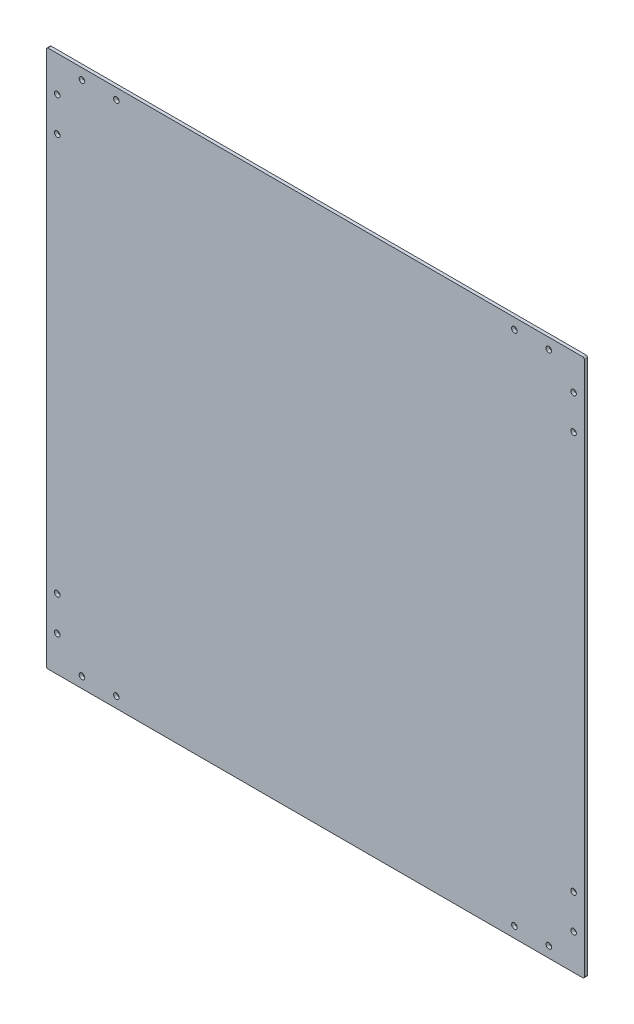
ISO-10303-21;
HEADER;
FILE_DESCRIPTION(('STEP AP214'),'2;1');
FILE_NAME('part.step','',(''),(''),'','','');
FILE_SCHEMA(('AUTOMOTIVE_DESIGN { 1 0 10303 214 1 1 1 1 }'));
ENDSEC;
DATA;
#1=APPLICATION_CONTEXT('core data for automotive mechanical design processes');
#2=APPLICATION_PROTOCOL_DEFINITION('international standard','automotive_design',2000,#1);
#3=PRODUCT_CONTEXT('',#1,'mechanical');
#4=PRODUCT('Part','Part','',(#3));
#5=PRODUCT_RELATED_PRODUCT_CATEGORY('part','',(#4));
#6=PRODUCT_DEFINITION_FORMATION('','',#4);
#7=PRODUCT_DEFINITION_CONTEXT('part definition',#1,'design');
#8=PRODUCT_DEFINITION('design','',#6,#7);
#9=PRODUCT_DEFINITION_SHAPE('','',#8);
#10=(LENGTH_UNIT() NAMED_UNIT(*) SI_UNIT(.MILLI.,.METRE.));
#11=(NAMED_UNIT(*) PLANE_ANGLE_UNIT() SI_UNIT($,.RADIAN.));
#12=(NAMED_UNIT(*) SI_UNIT($,.STERADIAN.) SOLID_ANGLE_UNIT());
#13=UNCERTAINTY_MEASURE_WITH_UNIT(LENGTH_MEASURE(1.E-05),#10,'distance_accuracy_value','');
#14=(GEOMETRIC_REPRESENTATION_CONTEXT(3) GLOBAL_UNCERTAINTY_ASSIGNED_CONTEXT((#13)) GLOBAL_UNIT_ASSIGNED_CONTEXT((#10,
#11,#12)) REPRESENTATION_CONTEXT('',''));
#15=CARTESIAN_POINT('',(0.,0.,0.));
#16=DIRECTION('',(0.,0.,1.));
#17=DIRECTION('',(1.,0.,0.));
#18=AXIS2_PLACEMENT_3D('',#15,#16,#17);
#19=CARTESIAN_POINT('',(0.,0.,3.));
#20=DIRECTION('',(0.,0.,1.));
#21=DIRECTION('',(1.,0.,0.));
#22=AXIS2_PLACEMENT_3D('',#19,#20,#21);
#23=PLANE('',#22);
#24=CARTESIAN_POINT('',(216.999999999818,-8.11573031000989E-11,3.));
#25=DIRECTION('',(0.,0.,1.));
#26=DIRECTION('',(-1.,0.,0.));
#27=AXIS2_PLACEMENT_3D('',#24,#25,#26);
#28=CIRCLE('',#27,2.59999999999389);
#29=CARTESIAN_POINT('',(214.399999999824,-8.11573031000989E-11,3.));
#30=VERTEX_POINT('',#29);
#31=EDGE_CURVE('E331',#30,#30,#28,.T.);
#32=ORIENTED_EDGE('',*,*,#31,.F.);
#33=EDGE_LOOP('',(#32));
#34=FACE_BOUND('',#33,.T.);
#35=CARTESIAN_POINT('',(239.999999999818,-55.0000000000812,3.));
#36=DIRECTION('',(0.,0.,1.));
#37=DIRECTION('',(-1.,0.,0.));
#38=AXIS2_PLACEMENT_3D('',#35,#36,#37);
#39=CIRCLE('',#38,2.59999999999487);
#40=CARTESIAN_POINT('',(237.399999999823,-55.0000000000812,3.));
#41=VERTEX_POINT('',#40);
#42=EDGE_CURVE('E315',#41,#41,#39,.T.);
#43=ORIENTED_EDGE('',*,*,#42,.F.);
#44=EDGE_LOOP('',(#43));
#45=FACE_BOUND('',#44,.T.);
#46=CARTESIAN_POINT('',(239.999999999818,-456.999999999718,3.));
#47=DIRECTION('',(0.,0.,1.));
#48=DIRECTION('',(1.,0.,0.));
#49=AXIS2_PLACEMENT_3D('',#46,#47,#48);
#50=CIRCLE('',#49,2.60000000000587);
#51=CARTESIAN_POINT('',(242.599999999824,-456.999999999718,3.));
#52=VERTEX_POINT('',#51);
#53=EDGE_CURVE('E299',#52,#52,#50,.T.);
#54=ORIENTED_EDGE('',*,*,#53,.F.);
#55=EDGE_LOOP('',(#54));
#56=FACE_BOUND('',#55,.T.);
#57=CARTESIAN_POINT('',(184.999999999818,-479.999999999718,3.));
#58=DIRECTION('',(0.,0.,1.));
#59=DIRECTION('',(1.,0.,0.));
#60=AXIS2_PLACEMENT_3D('',#57,#58,#59);
#61=CIRCLE('',#60,2.60000000000601);
#62=CARTESIAN_POINT('',(187.599999999824,-479.999999999718,3.));
#63=VERTEX_POINT('',#62);
#64=EDGE_CURVE('E283',#63,#63,#61,.T.);
#65=ORIENTED_EDGE('',*,*,#64,.F.);
#66=EDGE_LOOP('',(#65));
#67=FACE_BOUND('',#66,.T.);
#68=CARTESIAN_POINT('',(-216.999999999818,-479.999999999718,3.));
#69=DIRECTION('',(0.,0.,1.));
#70=DIRECTION('',(-1.,0.,0.));
#71=AXIS2_PLACEMENT_3D('',#68,#69,#70);
#72=CIRCLE('',#71,2.59999999999999);
#73=CARTESIAN_POINT('',(-219.599999999818,-479.999999999718,3.));
#74=VERTEX_POINT('',#73);
#75=EDGE_CURVE('E267',#74,#74,#72,.T.);
#76=ORIENTED_EDGE('',*,*,#75,.F.);
#77=EDGE_LOOP('',(#76));
#78=FACE_BOUND('',#77,.T.);
#79=CARTESIAN_POINT('',(-239.999999999818,-424.999999999718,3.));
#80=DIRECTION('',(0.,0.,1.));
#81=DIRECTION('',(-1.,0.,0.));
#82=AXIS2_PLACEMENT_3D('',#79,#80,#81);
#83=CIRCLE('',#82,2.6);
#84=CARTESIAN_POINT('',(-242.599999999818,-424.999999999718,3.));
#85=VERTEX_POINT('',#84);
#86=EDGE_CURVE('E251',#85,#85,#83,.T.);
#87=ORIENTED_EDGE('',*,*,#86,.F.);
#88=EDGE_LOOP('',(#87));
#89=FACE_BOUND('',#88,.T.);
#90=CARTESIAN_POINT('',(-239.999999999818,-23.0000000000812,3.));
#91=DIRECTION('',(0.,0.,1.));
#92=DIRECTION('',(1.,0.,0.));
#93=AXIS2_PLACEMENT_3D('',#90,#91,#92);
#94=CIRCLE('',#93,2.59999999999999);
#95=CARTESIAN_POINT('',(-237.399999999818,-23.0000000000812,3.));
#96=VERTEX_POINT('',#95);
#97=EDGE_CURVE('E235',#96,#96,#94,.T.);
#98=ORIENTED_EDGE('',*,*,#97,.F.);
#99=EDGE_LOOP('',(#98));
#100=FACE_BOUND('',#99,.T.);
#101=CARTESIAN_POINT('',(-184.999999999818,-8.12405698269458E-11,3.));
#102=DIRECTION('',(0.,0.,1.));
#103=DIRECTION('',(1.,0.,0.));
#104=AXIS2_PLACEMENT_3D('',#101,#102,#103);
#105=CIRCLE('',#104,2.59999999999999);
#106=CARTESIAN_POINT('',(-182.399999999818,-8.12405698269458E-11,3.));
#107=VERTEX_POINT('',#106);
#108=EDGE_CURVE('E220',#107,#107,#105,.T.);
#109=ORIENTED_EDGE('',*,*,#108,.F.);
#110=EDGE_LOOP('',(#109));
#111=FACE_BOUND('',#110,.T.);
#112=DIRECTION('',(1.,0.,0.));
#113=VECTOR('',#112,1.);
#114=CARTESIAN_POINT('',(-249.999999999818,-489.999999999718,3.));
#115=LINE('',#114,#113);
#116=CARTESIAN_POINT('',(-248.499999999818,-489.999999999718,3.));
#117=VERTEX_POINT('',#116);
#118=CARTESIAN_POINT('',(248.499999999824,-489.999999999718,3.));
#119=VERTEX_POINT('',#118);
#120=EDGE_CURVE('E206',#117,#119,#115,.T.);
#121=ORIENTED_EDGE('',*,*,#120,.T.);
#122=CARTESIAN_POINT('',(248.499999999824,-488.499999999718,3.));
#123=DIRECTION('',(0.,0.,1.));
#124=DIRECTION('',(1.,0.,0.));
#125=AXIS2_PLACEMENT_3D('',#122,#123,#124);
#126=CIRCLE('',#125,1.5);
#127=CARTESIAN_POINT('',(249.999999999824,-488.499999999718,3.));
#128=VERTEX_POINT('',#127);
#129=EDGE_CURVE('E178',#119,#128,#126,.T.);
#130=ORIENTED_EDGE('',*,*,#129,.T.);
#131=DIRECTION('',(0.,1.,0.));
#132=VECTOR('',#131,1.);
#133=CARTESIAN_POINT('',(249.999999999824,9.99999999991877,3.));
#134=LINE('',#133,#132);
#135=CARTESIAN_POINT('',(249.999999999824,8.49999999991877,3.));
#136=VERTEX_POINT('',#135);
#137=EDGE_CURVE('E134',#128,#136,#134,.T.);
#138=ORIENTED_EDGE('',*,*,#137,.T.);
#139=CARTESIAN_POINT('',(248.499999999824,8.49999999991877,3.));
#140=DIRECTION('',(0.,0.,1.));
#141=DIRECTION('',(1.,0.,0.));
#142=AXIS2_PLACEMENT_3D('',#139,#140,#141);
#143=CIRCLE('',#142,1.5);
#144=CARTESIAN_POINT('',(248.499999999824,9.99999999991877,3.));
#145=VERTEX_POINT('',#144);
#146=EDGE_CURVE('E69',#136,#145,#143,.T.);
#147=ORIENTED_EDGE('',*,*,#146,.T.);
#148=DIRECTION('',(-1.,0.,0.));
#149=VECTOR('',#148,1.);
#150=CARTESIAN_POINT('',(-249.999999999818,9.99999999991877,3.));
#151=LINE('',#150,#149);
#152=CARTESIAN_POINT('',(-248.499999999818,9.99999999991877,3.));
#153=VERTEX_POINT('',#152);
#154=EDGE_CURVE('E156',#145,#153,#151,.T.);
#155=ORIENTED_EDGE('',*,*,#154,.T.);
#156=CARTESIAN_POINT('',(-248.499999999818,8.49999999991877,3.));
#157=DIRECTION('',(0.,0.,1.));
#158=DIRECTION('',(1.,0.,0.));
#159=AXIS2_PLACEMENT_3D('',#156,#157,#158);
#160=CIRCLE('',#159,1.5);
#161=CARTESIAN_POINT('',(-249.999999999818,8.49999999991877,3.));
#162=VERTEX_POINT('',#161);
#163=EDGE_CURVE('E172',#153,#162,#160,.T.);
#164=ORIENTED_EDGE('',*,*,#163,.T.);
#165=DIRECTION('',(0.,-1.,0.));
#166=VECTOR('',#165,1.);
#167=CARTESIAN_POINT('',(-249.999999999818,9.99999999991877,3.));
#168=LINE('',#167,#166);
#169=CARTESIAN_POINT('',(-249.999999999818,-488.499999999718,3.));
#170=VERTEX_POINT('',#169);
#171=EDGE_CURVE('E149',#162,#170,#168,.T.);
#172=ORIENTED_EDGE('',*,*,#171,.T.);
#173=CARTESIAN_POINT('',(-248.499999999818,-488.499999999718,3.));
#174=DIRECTION('',(0.,0.,1.));
#175=DIRECTION('',(1.,0.,0.));
#176=AXIS2_PLACEMENT_3D('',#173,#174,#175);
#177=CIRCLE('',#176,1.5);
#178=EDGE_CURVE('E175',#170,#117,#177,.T.);
#179=ORIENTED_EDGE('',*,*,#178,.T.);
#180=EDGE_LOOP('',(#121,#130,#138,#147,#155,#164,#172,#179));
#181=FACE_BOUND('',#180,.T.);
#182=CARTESIAN_POINT('',(-216.999999999818,-8.12128142513302E-11,3.));
#183=DIRECTION('',(0.,0.,1.));
#184=DIRECTION('',(1.,0.,0.));
#185=AXIS2_PLACEMENT_3D('',#182,#183,#184);
#186=CIRCLE('',#185,2.59999999999999);
#187=CARTESIAN_POINT('',(-214.399999999818,-8.12128142513302E-11,3.));
#188=VERTEX_POINT('',#187);
#189=EDGE_CURVE('E229',#188,#188,#186,.T.);
#190=ORIENTED_EDGE('',*,*,#189,.F.);
#191=EDGE_LOOP('',(#190));
#192=FACE_BOUND('',#191,.T.);
#193=CARTESIAN_POINT('',(-239.999999999818,-55.0000000000812,3.));
#194=DIRECTION('',(0.,0.,1.));
#195=DIRECTION('',(1.,0.,0.));
#196=AXIS2_PLACEMENT_3D('',#193,#194,#195);
#197=CIRCLE('',#196,2.59999999999999);
#198=CARTESIAN_POINT('',(-237.399999999818,-55.0000000000812,3.));
#199=VERTEX_POINT('',#198);
#200=EDGE_CURVE('E243',#199,#199,#197,.T.);
#201=ORIENTED_EDGE('',*,*,#200,.F.);
#202=EDGE_LOOP('',(#201));
#203=FACE_BOUND('',#202,.T.);
#204=CARTESIAN_POINT('',(-239.999999999818,-456.999999999718,3.));
#205=DIRECTION('',(0.,0.,1.));
#206=DIRECTION('',(-1.,0.,0.));
#207=AXIS2_PLACEMENT_3D('',#204,#205,#206);
#208=CIRCLE('',#207,2.6);
#209=CARTESIAN_POINT('',(-242.599999999818,-456.999999999718,3.));
#210=VERTEX_POINT('',#209);
#211=EDGE_CURVE('E259',#210,#210,#208,.T.);
#212=ORIENTED_EDGE('',*,*,#211,.F.);
#213=EDGE_LOOP('',(#212));
#214=FACE_BOUND('',#213,.T.);
#215=CARTESIAN_POINT('',(-184.999999999818,-479.999999999718,3.));
#216=DIRECTION('',(0.,0.,1.));
#217=DIRECTION('',(-1.,0.,0.));
#218=AXIS2_PLACEMENT_3D('',#215,#216,#217);
#219=CIRCLE('',#218,2.59999999999999);
#220=CARTESIAN_POINT('',(-187.599999999818,-479.999999999718,3.));
#221=VERTEX_POINT('',#220);
#222=EDGE_CURVE('E275',#221,#221,#219,.T.);
#223=ORIENTED_EDGE('',*,*,#222,.F.);
#224=EDGE_LOOP('',(#223));
#225=FACE_BOUND('',#224,.T.);
#226=CARTESIAN_POINT('',(216.999999999818,-479.999999999718,3.));
#227=DIRECTION('',(0.,0.,1.));
#228=DIRECTION('',(1.,0.,0.));
#229=AXIS2_PLACEMENT_3D('',#226,#227,#228);
#230=CIRCLE('',#229,2.6000000000062);
#231=CARTESIAN_POINT('',(219.599999999825,-479.999999999718,3.));
#232=VERTEX_POINT('',#231);
#233=EDGE_CURVE('E291',#232,#232,#230,.T.);
#234=ORIENTED_EDGE('',*,*,#233,.F.);
#235=EDGE_LOOP('',(#234));
#236=FACE_BOUND('',#235,.T.);
#237=CARTESIAN_POINT('',(239.999999999818,-424.999999999718,3.));
#238=DIRECTION('',(0.,0.,1.));
#239=DIRECTION('',(1.,0.,0.));
#240=AXIS2_PLACEMENT_3D('',#237,#238,#239);
#241=CIRCLE('',#240,2.60000000000523);
#242=CARTESIAN_POINT('',(242.599999999824,-424.999999999718,3.));
#243=VERTEX_POINT('',#242);
#244=EDGE_CURVE('E307',#243,#243,#241,.T.);
#245=ORIENTED_EDGE('',*,*,#244,.F.);
#246=EDGE_LOOP('',(#245));
#247=FACE_BOUND('',#246,.T.);
#248=CARTESIAN_POINT('',(239.999999999818,-23.0000000000812,3.));
#249=DIRECTION('',(0.,0.,1.));
#250=DIRECTION('',(-1.,0.,0.));
#251=AXIS2_PLACEMENT_3D('',#248,#249,#250);
#252=CIRCLE('',#251,2.59999999999423);
#253=CARTESIAN_POINT('',(237.399999999824,-23.0000000000812,3.));
#254=VERTEX_POINT('',#253);
#255=EDGE_CURVE('E323',#254,#254,#252,.T.);
#256=ORIENTED_EDGE('',*,*,#255,.F.);
#257=EDGE_LOOP('',(#256));
#258=FACE_BOUND('',#257,.T.);
#259=CARTESIAN_POINT('',(184.999999999818,-8.11850586757146E-11,3.));
#260=DIRECTION('',(0.,0.,1.));
#261=DIRECTION('',(-1.,0.,0.));
#262=AXIS2_PLACEMENT_3D('',#259,#260,#261);
#263=CIRCLE('',#262,2.59999999999409);
#264=CARTESIAN_POINT('',(182.399999999824,-8.11850586757146E-11,3.));
#265=VERTEX_POINT('',#264);
#266=EDGE_CURVE('E339',#265,#265,#263,.T.);
#267=ORIENTED_EDGE('',*,*,#266,.F.);
#268=EDGE_LOOP('',(#267));
#269=FACE_BOUND('',#268,.T.);
#270=ADVANCED_FACE('F48',(#34,#45,#56,#67,#78,#89,#100,#111,#181,#192,#203,#214,#225,#236,#247,
#258,#269),#23,.T.);
#271=CARTESIAN_POINT('',(0.,0.,0.));
#272=DIRECTION('',(0.,0.,1.));
#273=DIRECTION('',(1.,0.,0.));
#274=AXIS2_PLACEMENT_3D('',#271,#272,#273);
#275=PLANE('',#274);
#276=DIRECTION('',(0.,1.,0.));
#277=VECTOR('',#276,1.);
#278=CARTESIAN_POINT('',(249.999999999824,9.99999999991877,0.));
#279=LINE('',#278,#277);
#280=CARTESIAN_POINT('',(249.999999999824,-488.499999999718,0.));
#281=VERTEX_POINT('',#280);
#282=CARTESIAN_POINT('',(249.999999999824,8.49999999991877,0.));
#283=VERTEX_POINT('',#282);
#284=EDGE_CURVE('E132',#281,#283,#279,.T.);
#285=ORIENTED_EDGE('',*,*,#284,.F.);
#286=CARTESIAN_POINT('',(248.499999999824,-488.499999999718,0.));
#287=DIRECTION('',(0.,0.,1.));
#288=DIRECTION('',(1.,0.,0.));
#289=AXIS2_PLACEMENT_3D('',#286,#287,#288);
#290=CIRCLE('',#289,1.5);
#291=CARTESIAN_POINT('',(248.499999999824,-489.999999999718,0.));
#292=VERTEX_POINT('',#291);
#293=EDGE_CURVE('E114',#281,#292,#290,.F.);
#294=ORIENTED_EDGE('',*,*,#293,.T.);
#295=DIRECTION('',(1.,0.,0.));
#296=VECTOR('',#295,1.);
#297=CARTESIAN_POINT('',(-249.999999999818,-489.999999999718,0.));
#298=LINE('',#297,#296);
#299=CARTESIAN_POINT('',(-248.499999999818,-489.999999999718,0.));
#300=VERTEX_POINT('',#299);
#301=EDGE_CURVE('E144',#300,#292,#298,.T.);
#302=ORIENTED_EDGE('',*,*,#301,.F.);
#303=CARTESIAN_POINT('',(-248.499999999818,-488.499999999718,0.));
#304=DIRECTION('',(0.,0.,1.));
#305=DIRECTION('',(1.,0.,0.));
#306=AXIS2_PLACEMENT_3D('',#303,#304,#305);
#307=CIRCLE('',#306,1.5);
#308=CARTESIAN_POINT('',(-249.999999999818,-488.499999999718,0.));
#309=VERTEX_POINT('',#308);
#310=EDGE_CURVE('E126',#300,#309,#307,.F.);
#311=ORIENTED_EDGE('',*,*,#310,.T.);
#312=DIRECTION('',(0.,-1.,0.));
#313=VECTOR('',#312,1.);
#314=CARTESIAN_POINT('',(-249.999999999818,9.99999999991877,0.));
#315=LINE('',#314,#313);
#316=CARTESIAN_POINT('',(-249.999999999818,8.49999999991877,0.));
#317=VERTEX_POINT('',#316);
#318=EDGE_CURVE('E151',#317,#309,#315,.T.);
#319=ORIENTED_EDGE('',*,*,#318,.F.);
#320=CARTESIAN_POINT('',(-248.499999999818,8.49999999991877,0.));
#321=DIRECTION('',(0.,0.,1.));
#322=DIRECTION('',(1.,0.,0.));
#323=AXIS2_PLACEMENT_3D('',#320,#321,#322);
#324=CIRCLE('',#323,1.5);
#325=CARTESIAN_POINT('',(-248.499999999818,9.99999999991877,0.));
#326=VERTEX_POINT('',#325);
#327=EDGE_CURVE('E160',#317,#326,#324,.F.);
#328=ORIENTED_EDGE('',*,*,#327,.T.);
#329=DIRECTION('',(-1.,0.,0.));
#330=VECTOR('',#329,1.);
#331=CARTESIAN_POINT('',(-249.999999999818,9.99999999991877,0.));
#332=LINE('',#331,#330);
#333=CARTESIAN_POINT('',(248.499999999824,9.99999999991877,0.));
#334=VERTEX_POINT('',#333);
#335=EDGE_CURVE('E143',#334,#326,#332,.T.);
#336=ORIENTED_EDGE('',*,*,#335,.F.);
#337=CARTESIAN_POINT('',(248.499999999824,8.49999999991877,0.));
#338=DIRECTION('',(0.,0.,1.));
#339=DIRECTION('',(1.,0.,0.));
#340=AXIS2_PLACEMENT_3D('',#337,#338,#339);
#341=CIRCLE('',#340,1.5);
#342=EDGE_CURVE('E136',#334,#283,#341,.F.);
#343=ORIENTED_EDGE('',*,*,#342,.T.);
#344=EDGE_LOOP('',(#285,#294,#302,#311,#319,#328,#336,#343));
#345=FACE_BOUND('',#344,.T.);
#346=CARTESIAN_POINT('',(-184.999999999818,-8.12405698269458E-11,0.));
#347=DIRECTION('',(0.,0.,1.));
#348=DIRECTION('',(1.,0.,0.));
#349=AXIS2_PLACEMENT_3D('',#346,#347,#348);
#350=CIRCLE('',#349,2.59999999999999);
#351=CARTESIAN_POINT('',(-182.399999999818,-8.12405698269458E-11,0.));
#352=VERTEX_POINT('',#351);
#353=EDGE_CURVE('E213',#352,#352,#350,.T.);
#354=ORIENTED_EDGE('',*,*,#353,.T.);
#355=EDGE_LOOP('',(#354));
#356=FACE_BOUND('',#355,.T.);
#357=CARTESIAN_POINT('',(-216.999999999818,-8.12128142513302E-11,0.));
#358=DIRECTION('',(0.,0.,1.));
#359=DIRECTION('',(1.,0.,0.));
#360=AXIS2_PLACEMENT_3D('',#357,#358,#359);
#361=CIRCLE('',#360,2.59999999999999);
#362=CARTESIAN_POINT('',(-214.399999999818,-8.12128142513302E-11,0.));
#363=VERTEX_POINT('',#362);
#364=EDGE_CURVE('E231',#363,#363,#361,.T.);
#365=ORIENTED_EDGE('',*,*,#364,.T.);
#366=EDGE_LOOP('',(#365));
#367=FACE_BOUND('',#366,.T.);
#368=CARTESIAN_POINT('',(-239.999999999818,-23.0000000000812,0.));
#369=DIRECTION('',(0.,0.,1.));
#370=DIRECTION('',(1.,0.,0.));
#371=AXIS2_PLACEMENT_3D('',#368,#369,#370);
#372=CIRCLE('',#371,2.59999999999999);
#373=CARTESIAN_POINT('',(-237.399999999818,-23.0000000000812,0.));
#374=VERTEX_POINT('',#373);
#375=EDGE_CURVE('E239',#374,#374,#372,.T.);
#376=ORIENTED_EDGE('',*,*,#375,.T.);
#377=EDGE_LOOP('',(#376));
#378=FACE_BOUND('',#377,.T.);
#379=CARTESIAN_POINT('',(-239.999999999818,-55.0000000000812,0.));
#380=DIRECTION('',(0.,0.,1.));
#381=DIRECTION('',(1.,0.,0.));
#382=AXIS2_PLACEMENT_3D('',#379,#380,#381);
#383=CIRCLE('',#382,2.59999999999999);
#384=CARTESIAN_POINT('',(-237.399999999818,-55.0000000000812,0.));
#385=VERTEX_POINT('',#384);
#386=EDGE_CURVE('E247',#385,#385,#383,.T.);
#387=ORIENTED_EDGE('',*,*,#386,.T.);
#388=EDGE_LOOP('',(#387));
#389=FACE_BOUND('',#388,.T.);
#390=CARTESIAN_POINT('',(-239.999999999818,-424.999999999718,0.));
#391=DIRECTION('',(0.,0.,1.));
#392=DIRECTION('',(-1.,0.,0.));
#393=AXIS2_PLACEMENT_3D('',#390,#391,#392);
#394=CIRCLE('',#393,2.6);
#395=CARTESIAN_POINT('',(-242.599999999818,-424.999999999718,0.));
#396=VERTEX_POINT('',#395);
#397=EDGE_CURVE('E255',#396,#396,#394,.T.);
#398=ORIENTED_EDGE('',*,*,#397,.T.);
#399=EDGE_LOOP('',(#398));
#400=FACE_BOUND('',#399,.T.);
#401=CARTESIAN_POINT('',(-239.999999999818,-456.999999999718,0.));
#402=DIRECTION('',(0.,0.,1.));
#403=DIRECTION('',(-1.,0.,0.));
#404=AXIS2_PLACEMENT_3D('',#401,#402,#403);
#405=CIRCLE('',#404,2.6);
#406=CARTESIAN_POINT('',(-242.599999999818,-456.999999999718,0.));
#407=VERTEX_POINT('',#406);
#408=EDGE_CURVE('E263',#407,#407,#405,.T.);
#409=ORIENTED_EDGE('',*,*,#408,.T.);
#410=EDGE_LOOP('',(#409));
#411=FACE_BOUND('',#410,.T.);
#412=CARTESIAN_POINT('',(-216.999999999818,-479.999999999718,0.));
#413=DIRECTION('',(0.,0.,1.));
#414=DIRECTION('',(-1.,0.,0.));
#415=AXIS2_PLACEMENT_3D('',#412,#413,#414);
#416=CIRCLE('',#415,2.59999999999999);
#417=CARTESIAN_POINT('',(-219.599999999818,-479.999999999718,0.));
#418=VERTEX_POINT('',#417);
#419=EDGE_CURVE('E271',#418,#418,#416,.T.);
#420=ORIENTED_EDGE('',*,*,#419,.T.);
#421=EDGE_LOOP('',(#420));
#422=FACE_BOUND('',#421,.T.);
#423=CARTESIAN_POINT('',(-184.999999999818,-479.999999999718,0.));
#424=DIRECTION('',(0.,0.,1.));
#425=DIRECTION('',(-1.,0.,0.));
#426=AXIS2_PLACEMENT_3D('',#423,#424,#425);
#427=CIRCLE('',#426,2.59999999999999);
#428=CARTESIAN_POINT('',(-187.599999999818,-479.999999999718,0.));
#429=VERTEX_POINT('',#428);
#430=EDGE_CURVE('E279',#429,#429,#427,.T.);
#431=ORIENTED_EDGE('',*,*,#430,.T.);
#432=EDGE_LOOP('',(#431));
#433=FACE_BOUND('',#432,.T.);
#434=CARTESIAN_POINT('',(184.999999999818,-479.999999999718,0.));
#435=DIRECTION('',(0.,0.,1.));
#436=DIRECTION('',(1.,0.,0.));
#437=AXIS2_PLACEMENT_3D('',#434,#435,#436);
#438=CIRCLE('',#437,2.60000000000601);
#439=CARTESIAN_POINT('',(187.599999999824,-479.999999999718,0.));
#440=VERTEX_POINT('',#439);
#441=EDGE_CURVE('E287',#440,#440,#438,.T.);
#442=ORIENTED_EDGE('',*,*,#441,.T.);
#443=EDGE_LOOP('',(#442));
#444=FACE_BOUND('',#443,.T.);
#445=CARTESIAN_POINT('',(216.999999999818,-479.999999999718,0.));
#446=DIRECTION('',(0.,0.,1.));
#447=DIRECTION('',(1.,0.,0.));
#448=AXIS2_PLACEMENT_3D('',#445,#446,#447);
#449=CIRCLE('',#448,2.6000000000062);
#450=CARTESIAN_POINT('',(219.599999999825,-479.999999999718,0.));
#451=VERTEX_POINT('',#450);
#452=EDGE_CURVE('E295',#451,#451,#449,.T.);
#453=ORIENTED_EDGE('',*,*,#452,.T.);
#454=EDGE_LOOP('',(#453));
#455=FACE_BOUND('',#454,.T.);
#456=CARTESIAN_POINT('',(239.999999999818,-456.999999999718,0.));
#457=DIRECTION('',(0.,0.,1.));
#458=DIRECTION('',(1.,0.,0.));
#459=AXIS2_PLACEMENT_3D('',#456,#457,#458);
#460=CIRCLE('',#459,2.60000000000587);
#461=CARTESIAN_POINT('',(242.599999999824,-456.999999999718,0.));
#462=VERTEX_POINT('',#461);
#463=EDGE_CURVE('E303',#462,#462,#460,.T.);
#464=ORIENTED_EDGE('',*,*,#463,.T.);
#465=EDGE_LOOP('',(#464));
#466=FACE_BOUND('',#465,.T.);
#467=CARTESIAN_POINT('',(239.999999999818,-424.999999999718,0.));
#468=DIRECTION('',(0.,0.,1.));
#469=DIRECTION('',(1.,0.,0.));
#470=AXIS2_PLACEMENT_3D('',#467,#468,#469);
#471=CIRCLE('',#470,2.60000000000523);
#472=CARTESIAN_POINT('',(242.599999999824,-424.999999999718,0.));
#473=VERTEX_POINT('',#472);
#474=EDGE_CURVE('E311',#473,#473,#471,.T.);
#475=ORIENTED_EDGE('',*,*,#474,.T.);
#476=EDGE_LOOP('',(#475));
#477=FACE_BOUND('',#476,.T.);
#478=CARTESIAN_POINT('',(239.999999999818,-55.0000000000812,0.));
#479=DIRECTION('',(0.,0.,1.));
#480=DIRECTION('',(-1.,0.,0.));
#481=AXIS2_PLACEMENT_3D('',#478,#479,#480);
#482=CIRCLE('',#481,2.59999999999487);
#483=CARTESIAN_POINT('',(237.399999999823,-55.0000000000812,0.));
#484=VERTEX_POINT('',#483);
#485=EDGE_CURVE('E319',#484,#484,#482,.T.);
#486=ORIENTED_EDGE('',*,*,#485,.T.);
#487=EDGE_LOOP('',(#486));
#488=FACE_BOUND('',#487,.T.);
#489=CARTESIAN_POINT('',(239.999999999818,-23.0000000000812,0.));
#490=DIRECTION('',(0.,0.,1.));
#491=DIRECTION('',(-1.,0.,0.));
#492=AXIS2_PLACEMENT_3D('',#489,#490,#491);
#493=CIRCLE('',#492,2.59999999999423);
#494=CARTESIAN_POINT('',(237.399999999824,-23.0000000000812,0.));
#495=VERTEX_POINT('',#494);
#496=EDGE_CURVE('E327',#495,#495,#493,.T.);
#497=ORIENTED_EDGE('',*,*,#496,.T.);
#498=EDGE_LOOP('',(#497));
#499=FACE_BOUND('',#498,.T.);
#500=CARTESIAN_POINT('',(216.999999999818,-8.11573031000989E-11,0.));
#501=DIRECTION('',(0.,0.,1.));
#502=DIRECTION('',(-1.,0.,0.));
#503=AXIS2_PLACEMENT_3D('',#500,#501,#502);
#504=CIRCLE('',#503,2.59999999999389);
#505=CARTESIAN_POINT('',(214.399999999824,-8.11573031000989E-11,0.));
#506=VERTEX_POINT('',#505);
#507=EDGE_CURVE('E335',#506,#506,#504,.T.);
#508=ORIENTED_EDGE('',*,*,#507,.T.);
#509=EDGE_LOOP('',(#508));
#510=FACE_BOUND('',#509,.T.);
#511=CARTESIAN_POINT('',(184.999999999818,-8.11850586757146E-11,0.));
#512=DIRECTION('',(0.,0.,1.));
#513=DIRECTION('',(-1.,0.,0.));
#514=AXIS2_PLACEMENT_3D('',#511,#512,#513);
#515=CIRCLE('',#514,2.59999999999409);
#516=CARTESIAN_POINT('',(182.399999999824,-8.11850586757146E-11,0.));
#517=VERTEX_POINT('',#516);
#518=EDGE_CURVE('E343',#517,#517,#515,.T.);
#519=ORIENTED_EDGE('',*,*,#518,.T.);
#520=EDGE_LOOP('',(#519));
#521=FACE_BOUND('',#520,.T.);
#522=ADVANCED_FACE('F139',(#345,#356,#367,#378,#389,#400,#411,#422,#433,#444,#455,#466,#477,
#488,#499,#510,#521),#275,.F.);
#523=CARTESIAN_POINT('',(-249.999999999818,9.99999999991877,3.));
#524=DIRECTION('',(1.,0.,0.));
#525=DIRECTION('',(0.,1.,0.));
#526=AXIS2_PLACEMENT_3D('',#523,#524,#525);
#527=PLANE('',#526);
#528=ORIENTED_EDGE('',*,*,#318,.T.);
#529=DIRECTION('',(0.,0.,-1.));
#530=VECTOR('',#529,1.);
#531=CARTESIAN_POINT('',(-249.999999999818,-488.499999999718,3.));
#532=LINE('',#531,#530);
#533=EDGE_CURVE('E185',#309,#170,#532,.F.);
#534=ORIENTED_EDGE('',*,*,#533,.T.);
#535=ORIENTED_EDGE('',*,*,#171,.F.);
#536=DIRECTION('',(0.,0.,-1.));
#537=VECTOR('',#536,1.);
#538=CARTESIAN_POINT('',(-249.999999999818,8.49999999991877,3.));
#539=LINE('',#538,#537);
#540=EDGE_CURVE('E181',#162,#317,#539,.T.);
#541=ORIENTED_EDGE('',*,*,#540,.T.);
#542=EDGE_LOOP('',(#528,#534,#535,#541));
#543=FACE_BOUND('',#542,.T.);
#544=ADVANCED_FACE('F201',(#543),#527,.F.);
#545=CARTESIAN_POINT('',(-249.999999999818,-489.999999999718,3.));
#546=DIRECTION('',(0.,1.,0.));
#547=DIRECTION('',(0.,0.,1.));
#548=AXIS2_PLACEMENT_3D('',#545,#546,#547);
#549=PLANE('',#548);
#550=ORIENTED_EDGE('',*,*,#301,.T.);
#551=DIRECTION('',(0.,0.,-1.));
#552=VECTOR('',#551,1.);
#553=CARTESIAN_POINT('',(248.499999999824,-489.999999999718,3.));
#554=LINE('',#553,#552);
#555=EDGE_CURVE('E119',#292,#119,#554,.F.);
#556=ORIENTED_EDGE('',*,*,#555,.T.);
#557=ORIENTED_EDGE('',*,*,#120,.F.);
#558=DIRECTION('',(0.,0.,-1.));
#559=VECTOR('',#558,1.);
#560=CARTESIAN_POINT('',(-248.499999999818,-489.999999999718,3.));
#561=LINE('',#560,#559);
#562=EDGE_CURVE('E125',#117,#300,#561,.T.);
#563=ORIENTED_EDGE('',*,*,#562,.T.);
#564=EDGE_LOOP('',(#550,#556,#557,#563));
#565=FACE_BOUND('',#564,.T.);
#566=ADVANCED_FACE('F372',(#565),#549,.F.);
#567=CARTESIAN_POINT('',(249.999999999824,9.99999999991877,3.));
#568=DIRECTION('',(-1.,0.,0.));
#569=DIRECTION('',(0.,-1.,0.));
#570=AXIS2_PLACEMENT_3D('',#567,#568,#569);
#571=PLANE('',#570);
#572=ORIENTED_EDGE('',*,*,#137,.F.);
#573=DIRECTION('',(0.,0.,-1.));
#574=VECTOR('',#573,1.);
#575=CARTESIAN_POINT('',(249.999999999824,-488.499999999718,3.));
#576=LINE('',#575,#574);
#577=EDGE_CURVE('E118',#128,#281,#576,.T.);
#578=ORIENTED_EDGE('',*,*,#577,.T.);
#579=ORIENTED_EDGE('',*,*,#284,.T.);
#580=DIRECTION('',(0.,0.,-1.));
#581=VECTOR('',#580,1.);
#582=CARTESIAN_POINT('',(249.999999999824,8.49999999991877,3.));
#583=LINE('',#582,#581);
#584=EDGE_CURVE('E137',#283,#136,#583,.F.);
#585=ORIENTED_EDGE('',*,*,#584,.T.);
#586=EDGE_LOOP('',(#572,#578,#579,#585));
#587=FACE_BOUND('',#586,.T.);
#588=ADVANCED_FACE('F131',(#587),#571,.F.);
#589=CARTESIAN_POINT('',(-249.999999999818,9.99999999991877,3.));
#590=DIRECTION('',(0.,-1.,0.));
#591=DIRECTION('',(0.,0.,-1.));
#592=AXIS2_PLACEMENT_3D('',#589,#590,#591);
#593=PLANE('',#592);
#594=ORIENTED_EDGE('',*,*,#335,.T.);
#595=DIRECTION('',(0.,0.,-1.));
#596=VECTOR('',#595,1.);
#597=CARTESIAN_POINT('',(-248.499999999818,9.99999999991877,3.));
#598=LINE('',#597,#596);
#599=EDGE_CURVE('E13',#326,#153,#598,.F.);
#600=ORIENTED_EDGE('',*,*,#599,.T.);
#601=ORIENTED_EDGE('',*,*,#154,.F.);
#602=DIRECTION('',(0.,0.,-1.));
#603=VECTOR('',#602,1.);
#604=CARTESIAN_POINT('',(248.499999999824,9.99999999991877,3.));
#605=LINE('',#604,#603);
#606=EDGE_CURVE('E57',#145,#334,#605,.T.);
#607=ORIENTED_EDGE('',*,*,#606,.T.);
#608=EDGE_LOOP('',(#594,#600,#601,#607));
#609=FACE_BOUND('',#608,.T.);
#610=ADVANCED_FACE('F191',(#609),#593,.F.);
#611=CARTESIAN_POINT('',(-184.999999999818,-8.12405698269458E-11,3.));
#612=DIRECTION('',(0.,0.,-1.));
#613=DIRECTION('',(-1.,0.,0.));
#614=AXIS2_PLACEMENT_3D('',#611,#612,#613);
#615=CYLINDRICAL_SURFACE('',#614,2.59999999999999);
#616=ORIENTED_EDGE('',*,*,#108,.T.);
#617=EDGE_LOOP('',(#616));
#618=FACE_BOUND('',#617,.T.);
#619=ORIENTED_EDGE('',*,*,#353,.F.);
#620=EDGE_LOOP('',(#619));
#621=FACE_BOUND('',#620,.T.);
#622=ADVANCED_FACE('F365',(#618,#621),#615,.F.);
#623=CARTESIAN_POINT('',(-216.999999999818,-8.12128142513302E-11,3.));
#624=DIRECTION('',(0.,0.,-1.));
#625=DIRECTION('',(-1.,0.,0.));
#626=AXIS2_PLACEMENT_3D('',#623,#624,#625);
#627=CYLINDRICAL_SURFACE('',#626,2.59999999999999);
#628=ORIENTED_EDGE('',*,*,#189,.T.);
#629=EDGE_LOOP('',(#628));
#630=FACE_BOUND('',#629,.T.);
#631=ORIENTED_EDGE('',*,*,#364,.F.);
#632=EDGE_LOOP('',(#631));
#633=FACE_BOUND('',#632,.T.);
#634=ADVANCED_FACE('F467',(#630,#633),#627,.F.);
#635=CARTESIAN_POINT('',(-239.999999999818,-23.0000000000812,3.));
#636=DIRECTION('',(0.,0.,-1.));
#637=DIRECTION('',(-1.,0.,0.));
#638=AXIS2_PLACEMENT_3D('',#635,#636,#637);
#639=CYLINDRICAL_SURFACE('',#638,2.59999999999999);
#640=ORIENTED_EDGE('',*,*,#97,.T.);
#641=EDGE_LOOP('',(#640));
#642=FACE_BOUND('',#641,.T.);
#643=ORIENTED_EDGE('',*,*,#375,.F.);
#644=EDGE_LOOP('',(#643));
#645=FACE_BOUND('',#644,.T.);
#646=ADVANCED_FACE('F464',(#642,#645),#639,.F.);
#647=CARTESIAN_POINT('',(-239.999999999818,-55.0000000000812,3.));
#648=DIRECTION('',(0.,0.,-1.));
#649=DIRECTION('',(-1.,0.,0.));
#650=AXIS2_PLACEMENT_3D('',#647,#648,#649);
#651=CYLINDRICAL_SURFACE('',#650,2.59999999999999);
#652=ORIENTED_EDGE('',*,*,#200,.T.);
#653=EDGE_LOOP('',(#652));
#654=FACE_BOUND('',#653,.T.);
#655=ORIENTED_EDGE('',*,*,#386,.F.);
#656=EDGE_LOOP('',(#655));
#657=FACE_BOUND('',#656,.T.);
#658=ADVANCED_FACE('F460',(#654,#657),#651,.F.);
#659=CARTESIAN_POINT('',(-239.999999999818,-424.999999999718,3.));
#660=DIRECTION('',(0.,0.,-1.));
#661=DIRECTION('',(-1.,0.,0.));
#662=AXIS2_PLACEMENT_3D('',#659,#660,#661);
#663=CYLINDRICAL_SURFACE('',#662,2.6);
#664=ORIENTED_EDGE('',*,*,#86,.T.);
#665=EDGE_LOOP('',(#664));
#666=FACE_BOUND('',#665,.T.);
#667=ORIENTED_EDGE('',*,*,#397,.F.);
#668=EDGE_LOOP('',(#667));
#669=FACE_BOUND('',#668,.T.);
#670=ADVANCED_FACE('F456',(#666,#669),#663,.F.);
#671=CARTESIAN_POINT('',(-239.999999999818,-456.999999999718,3.));
#672=DIRECTION('',(0.,0.,-1.));
#673=DIRECTION('',(-1.,0.,0.));
#674=AXIS2_PLACEMENT_3D('',#671,#672,#673);
#675=CYLINDRICAL_SURFACE('',#674,2.6);
#676=ORIENTED_EDGE('',*,*,#211,.T.);
#677=EDGE_LOOP('',(#676));
#678=FACE_BOUND('',#677,.T.);
#679=ORIENTED_EDGE('',*,*,#408,.F.);
#680=EDGE_LOOP('',(#679));
#681=FACE_BOUND('',#680,.T.);
#682=ADVANCED_FACE('F452',(#678,#681),#675,.F.);
#683=CARTESIAN_POINT('',(-216.999999999818,-479.999999999718,3.));
#684=DIRECTION('',(0.,0.,-1.));
#685=DIRECTION('',(-1.,0.,0.));
#686=AXIS2_PLACEMENT_3D('',#683,#684,#685);
#687=CYLINDRICAL_SURFACE('',#686,2.59999999999999);
#688=ORIENTED_EDGE('',*,*,#75,.T.);
#689=EDGE_LOOP('',(#688));
#690=FACE_BOUND('',#689,.T.);
#691=ORIENTED_EDGE('',*,*,#419,.F.);
#692=EDGE_LOOP('',(#691));
#693=FACE_BOUND('',#692,.T.);
#694=ADVANCED_FACE('F448',(#690,#693),#687,.F.);
#695=CARTESIAN_POINT('',(-184.999999999818,-479.999999999718,3.));
#696=DIRECTION('',(0.,0.,-1.));
#697=DIRECTION('',(-1.,0.,0.));
#698=AXIS2_PLACEMENT_3D('',#695,#696,#697);
#699=CYLINDRICAL_SURFACE('',#698,2.59999999999999);
#700=ORIENTED_EDGE('',*,*,#222,.T.);
#701=EDGE_LOOP('',(#700));
#702=FACE_BOUND('',#701,.T.);
#703=ORIENTED_EDGE('',*,*,#430,.F.);
#704=EDGE_LOOP('',(#703));
#705=FACE_BOUND('',#704,.T.);
#706=ADVANCED_FACE('F444',(#702,#705),#699,.F.);
#707=CARTESIAN_POINT('',(184.999999999818,-479.999999999718,3.));
#708=DIRECTION('',(0.,0.,-1.));
#709=DIRECTION('',(-1.,0.,0.));
#710=AXIS2_PLACEMENT_3D('',#707,#708,#709);
#711=CYLINDRICAL_SURFACE('',#710,2.60000000000601);
#712=ORIENTED_EDGE('',*,*,#64,.T.);
#713=EDGE_LOOP('',(#712));
#714=FACE_BOUND('',#713,.T.);
#715=ORIENTED_EDGE('',*,*,#441,.F.);
#716=EDGE_LOOP('',(#715));
#717=FACE_BOUND('',#716,.T.);
#718=ADVANCED_FACE('F440',(#714,#717),#711,.F.);
#719=CARTESIAN_POINT('',(216.999999999818,-479.999999999718,3.));
#720=DIRECTION('',(0.,0.,-1.));
#721=DIRECTION('',(-1.,0.,0.));
#722=AXIS2_PLACEMENT_3D('',#719,#720,#721);
#723=CYLINDRICAL_SURFACE('',#722,2.6000000000062);
#724=ORIENTED_EDGE('',*,*,#233,.T.);
#725=EDGE_LOOP('',(#724));
#726=FACE_BOUND('',#725,.T.);
#727=ORIENTED_EDGE('',*,*,#452,.F.);
#728=EDGE_LOOP('',(#727));
#729=FACE_BOUND('',#728,.T.);
#730=ADVANCED_FACE('F436',(#726,#729),#723,.F.);
#731=CARTESIAN_POINT('',(239.999999999818,-456.999999999718,3.));
#732=DIRECTION('',(0.,0.,-1.));
#733=DIRECTION('',(-1.,0.,0.));
#734=AXIS2_PLACEMENT_3D('',#731,#732,#733);
#735=CYLINDRICAL_SURFACE('',#734,2.60000000000587);
#736=ORIENTED_EDGE('',*,*,#53,.T.);
#737=EDGE_LOOP('',(#736));
#738=FACE_BOUND('',#737,.T.);
#739=ORIENTED_EDGE('',*,*,#463,.F.);
#740=EDGE_LOOP('',(#739));
#741=FACE_BOUND('',#740,.T.);
#742=ADVANCED_FACE('F432',(#738,#741),#735,.F.);
#743=CARTESIAN_POINT('',(239.999999999818,-424.999999999718,3.));
#744=DIRECTION('',(0.,0.,-1.));
#745=DIRECTION('',(-1.,0.,0.));
#746=AXIS2_PLACEMENT_3D('',#743,#744,#745);
#747=CYLINDRICAL_SURFACE('',#746,2.60000000000523);
#748=ORIENTED_EDGE('',*,*,#244,.T.);
#749=EDGE_LOOP('',(#748));
#750=FACE_BOUND('',#749,.T.);
#751=ORIENTED_EDGE('',*,*,#474,.F.);
#752=EDGE_LOOP('',(#751));
#753=FACE_BOUND('',#752,.T.);
#754=ADVANCED_FACE('F428',(#750,#753),#747,.F.);
#755=CARTESIAN_POINT('',(239.999999999818,-55.0000000000812,3.));
#756=DIRECTION('',(0.,0.,-1.));
#757=DIRECTION('',(-1.,0.,0.));
#758=AXIS2_PLACEMENT_3D('',#755,#756,#757);
#759=CYLINDRICAL_SURFACE('',#758,2.59999999999487);
#760=ORIENTED_EDGE('',*,*,#42,.T.);
#761=EDGE_LOOP('',(#760));
#762=FACE_BOUND('',#761,.T.);
#763=ORIENTED_EDGE('',*,*,#485,.F.);
#764=EDGE_LOOP('',(#763));
#765=FACE_BOUND('',#764,.T.);
#766=ADVANCED_FACE('F410',(#762,#765),#759,.F.);
#767=CARTESIAN_POINT('',(239.999999999818,-23.0000000000812,3.));
#768=DIRECTION('',(0.,0.,-1.));
#769=DIRECTION('',(-1.,0.,0.));
#770=AXIS2_PLACEMENT_3D('',#767,#768,#769);
#771=CYLINDRICAL_SURFACE('',#770,2.59999999999423);
#772=ORIENTED_EDGE('',*,*,#255,.T.);
#773=EDGE_LOOP('',(#772));
#774=FACE_BOUND('',#773,.T.);
#775=ORIENTED_EDGE('',*,*,#496,.F.);
#776=EDGE_LOOP('',(#775));
#777=FACE_BOUND('',#776,.T.);
#778=ADVANCED_FACE('F406',(#774,#777),#771,.F.);
#779=CARTESIAN_POINT('',(216.999999999818,-8.11573031000989E-11,3.));
#780=DIRECTION('',(0.,0.,-1.));
#781=DIRECTION('',(-1.,0.,0.));
#782=AXIS2_PLACEMENT_3D('',#779,#780,#781);
#783=CYLINDRICAL_SURFACE('',#782,2.59999999999389);
#784=ORIENTED_EDGE('',*,*,#31,.T.);
#785=EDGE_LOOP('',(#784));
#786=FACE_BOUND('',#785,.T.);
#787=ORIENTED_EDGE('',*,*,#507,.F.);
#788=EDGE_LOOP('',(#787));
#789=FACE_BOUND('',#788,.T.);
#790=ADVANCED_FACE('F409',(#786,#789),#783,.F.);
#791=CARTESIAN_POINT('',(184.999999999818,-8.11850586757146E-11,3.));
#792=DIRECTION('',(0.,0.,-1.));
#793=DIRECTION('',(-1.,0.,0.));
#794=AXIS2_PLACEMENT_3D('',#791,#792,#793);
#795=CYLINDRICAL_SURFACE('',#794,2.59999999999409);
#796=ORIENTED_EDGE('',*,*,#266,.T.);
#797=EDGE_LOOP('',(#796));
#798=FACE_BOUND('',#797,.T.);
#799=ORIENTED_EDGE('',*,*,#518,.F.);
#800=EDGE_LOOP('',(#799));
#801=FACE_BOUND('',#800,.T.);
#802=ADVANCED_FACE('F352',(#798,#801),#795,.F.);
#803=CARTESIAN_POINT('',(248.499999999824,-488.499999999718,3.));
#804=DIRECTION('',(0.,0.,-1.));
#805=DIRECTION('',(-1.,0.,0.));
#806=AXIS2_PLACEMENT_3D('',#803,#804,#805);
#807=CYLINDRICAL_SURFACE('',#806,1.5);
#808=ORIENTED_EDGE('',*,*,#129,.F.);
#809=ORIENTED_EDGE('',*,*,#555,.F.);
#810=ORIENTED_EDGE('',*,*,#293,.F.);
#811=ORIENTED_EDGE('',*,*,#577,.F.);
#812=EDGE_LOOP('',(#808,#809,#810,#811));
#813=FACE_BOUND('',#812,.T.);
#814=ADVANCED_FACE('F117',(#813),#807,.T.);
#815=CARTESIAN_POINT('',(-248.499999999818,-488.499999999718,3.));
#816=DIRECTION('',(0.,0.,-1.));
#817=DIRECTION('',(-1.,0.,0.));
#818=AXIS2_PLACEMENT_3D('',#815,#816,#817);
#819=CYLINDRICAL_SURFACE('',#818,1.5);
#820=ORIENTED_EDGE('',*,*,#178,.F.);
#821=ORIENTED_EDGE('',*,*,#533,.F.);
#822=ORIENTED_EDGE('',*,*,#310,.F.);
#823=ORIENTED_EDGE('',*,*,#562,.F.);
#824=EDGE_LOOP('',(#820,#821,#822,#823));
#825=FACE_BOUND('',#824,.T.);
#826=ADVANCED_FACE('F380',(#825),#819,.T.);
#827=CARTESIAN_POINT('',(-248.499999999818,8.49999999991877,3.));
#828=DIRECTION('',(0.,0.,-1.));
#829=DIRECTION('',(-1.,0.,0.));
#830=AXIS2_PLACEMENT_3D('',#827,#828,#829);
#831=CYLINDRICAL_SURFACE('',#830,1.5);
#832=ORIENTED_EDGE('',*,*,#163,.F.);
#833=ORIENTED_EDGE('',*,*,#599,.F.);
#834=ORIENTED_EDGE('',*,*,#327,.F.);
#835=ORIENTED_EDGE('',*,*,#540,.F.);
#836=EDGE_LOOP('',(#832,#833,#834,#835));
#837=FACE_BOUND('',#836,.T.);
#838=ADVANCED_FACE('F198',(#837),#831,.T.);
#839=CARTESIAN_POINT('',(248.499999999824,8.49999999991877,3.));
#840=DIRECTION('',(0.,0.,-1.));
#841=DIRECTION('',(-1.,0.,0.));
#842=AXIS2_PLACEMENT_3D('',#839,#840,#841);
#843=CYLINDRICAL_SURFACE('',#842,1.5);
#844=ORIENTED_EDGE('',*,*,#146,.F.);
#845=ORIENTED_EDGE('',*,*,#584,.F.);
#846=ORIENTED_EDGE('',*,*,#342,.F.);
#847=ORIENTED_EDGE('',*,*,#606,.F.);
#848=EDGE_LOOP('',(#844,#845,#846,#847));
#849=FACE_BOUND('',#848,.T.);
#850=ADVANCED_FACE('F50',(#849),#843,.T.);
#851=CLOSED_SHELL('',(#270,#522,#544,#566,#588,#610,#622,#634,#646,#658,#670,#682,#694,#706,
#718,#730,#742,#754,#766,#778,#790,#802,#814,#826,#838,#850));
#852=MANIFOLD_SOLID_BREP('B2',#851);
#853=ADVANCED_BREP_SHAPE_REPRESENTATION('',(#18,#852),#14);
#854=SHAPE_DEFINITION_REPRESENTATION(#9,#853);
ENDSEC;
END-ISO-10303-21;
